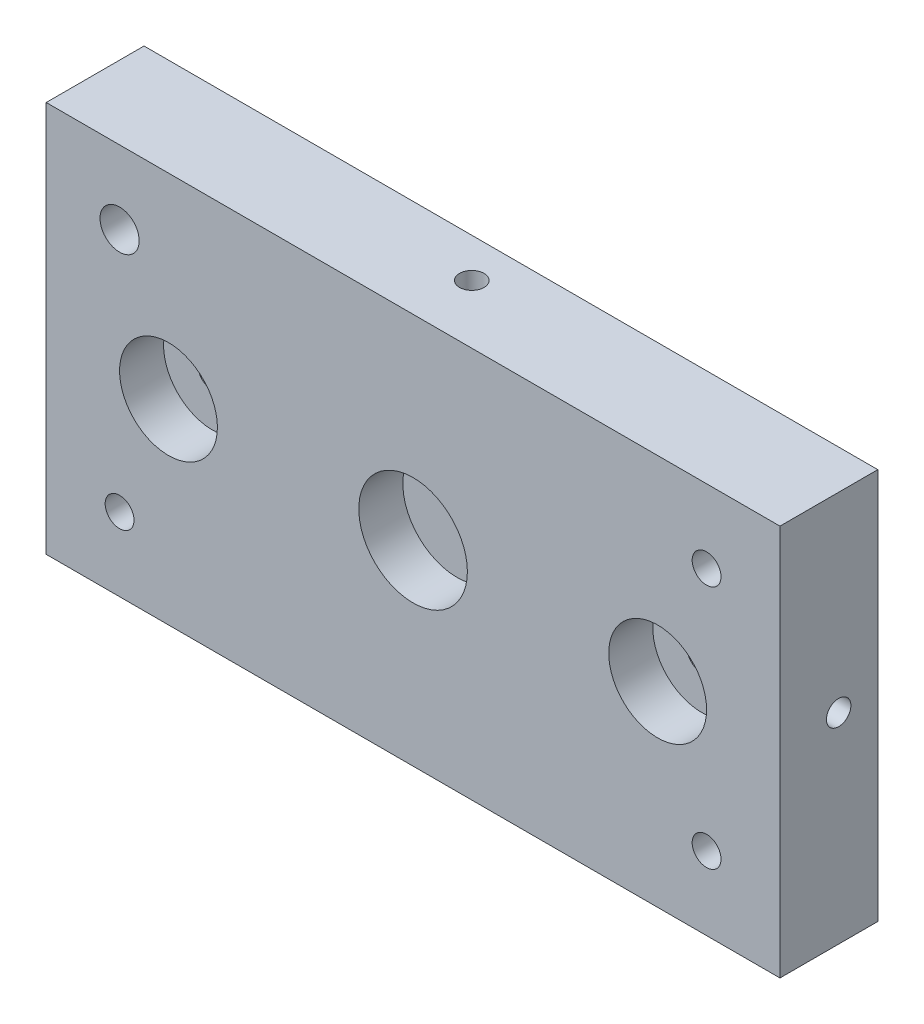
ISO-10303-21;
HEADER;
FILE_DESCRIPTION(('STEP AP214'),'2;1');
FILE_NAME('part.step','',(''),(''),'','','');
FILE_SCHEMA(('AUTOMOTIVE_DESIGN { 1 0 10303 214 1 1 1 1 }'));
ENDSEC;
DATA;
#1=APPLICATION_CONTEXT('core data for automotive mechanical design processes');
#2=APPLICATION_PROTOCOL_DEFINITION('international standard','automotive_design',2000,#1);
#3=PRODUCT_CONTEXT('',#1,'mechanical');
#4=PRODUCT('Part','Part','',(#3));
#5=PRODUCT_RELATED_PRODUCT_CATEGORY('part','',(#4));
#6=PRODUCT_DEFINITION_FORMATION('','',#4);
#7=PRODUCT_DEFINITION_CONTEXT('part definition',#1,'design');
#8=PRODUCT_DEFINITION('design','',#6,#7);
#9=PRODUCT_DEFINITION_SHAPE('','',#8);
#10=(LENGTH_UNIT() NAMED_UNIT(*) SI_UNIT(.MILLI.,.METRE.));
#11=(NAMED_UNIT(*) PLANE_ANGLE_UNIT() SI_UNIT($,.RADIAN.));
#12=(NAMED_UNIT(*) SI_UNIT($,.STERADIAN.) SOLID_ANGLE_UNIT());
#13=UNCERTAINTY_MEASURE_WITH_UNIT(LENGTH_MEASURE(1.E-05),#10,'distance_accuracy_value','');
#14=(GEOMETRIC_REPRESENTATION_CONTEXT(3) GLOBAL_UNCERTAINTY_ASSIGNED_CONTEXT((#13)) GLOBAL_UNIT_ASSIGNED_CONTEXT((#10,
#11,#12)) REPRESENTATION_CONTEXT('',''));
#15=CARTESIAN_POINT('',(0.,0.,0.));
#16=DIRECTION('',(0.,0.,1.));
#17=DIRECTION('',(1.,0.,0.));
#18=AXIS2_PLACEMENT_3D('',#15,#16,#17);
#19=CARTESIAN_POINT('',(50.,0.,-0.001000000000001));
#20=DIRECTION('',(0.,0.,1.));
#21=DIRECTION('',(1.,0.,0.));
#22=AXIS2_PLACEMENT_3D('',#19,#20,#21);
#23=CYLINDRICAL_SURFACE('',#22,3.);
#24=CARTESIAN_POINT('',(50.,0.,11.));
#25=DIRECTION('',(0.,0.,1.));
#26=DIRECTION('',(1.,0.,0.));
#27=AXIS2_PLACEMENT_3D('',#24,#25,#26);
#28=CIRCLE('',#27,3.);
#29=CARTESIAN_POINT('',(53.,0.,11.));
#30=VERTEX_POINT('',#29);
#31=EDGE_CURVE('E106',#30,#30,#28,.F.);
#32=ORIENTED_EDGE('',*,*,#31,.F.);
#33=EDGE_LOOP('',(#32));
#34=FACE_BOUND('',#33,.T.);
#35=CARTESIAN_POINT('',(50.,0.,5.));
#36=DIRECTION('',(0.,0.,-1.));
#37=DIRECTION('',(-1.,0.,0.));
#38=AXIS2_PLACEMENT_3D('',#35,#36,#37);
#39=CIRCLE('',#38,3.);
#40=CARTESIAN_POINT('',(47.,0.,5.));
#41=VERTEX_POINT('',#40);
#42=EDGE_CURVE('E40',#41,#41,#39,.F.);
#43=ORIENTED_EDGE('',*,*,#42,.F.);
#44=EDGE_LOOP('',(#43));
#45=FACE_BOUND('',#44,.T.);
#46=ADVANCED_FACE('F36',(#34,#45),#23,.F.);
#47=CARTESIAN_POINT('',(-50.,0.,-0.001000000000001));
#48=DIRECTION('',(0.,0.,1.));
#49=DIRECTION('',(1.,0.,0.));
#50=AXIS2_PLACEMENT_3D('',#47,#48,#49);
#51=CYLINDRICAL_SURFACE('',#50,3.);
#52=CARTESIAN_POINT('',(-50.,0.,11.));
#53=DIRECTION('',(0.,0.,1.));
#54=DIRECTION('',(1.,0.,0.));
#55=AXIS2_PLACEMENT_3D('',#52,#53,#54);
#56=CIRCLE('',#55,3.);
#57=CARTESIAN_POINT('',(-47.,0.,11.));
#58=VERTEX_POINT('',#57);
#59=EDGE_CURVE('E112',#58,#58,#56,.F.);
#60=ORIENTED_EDGE('',*,*,#59,.F.);
#61=EDGE_LOOP('',(#60));
#62=FACE_BOUND('',#61,.T.);
#63=CARTESIAN_POINT('',(-50.,0.,5.));
#64=DIRECTION('',(0.,0.,-1.));
#65=DIRECTION('',(-1.,0.,0.));
#66=AXIS2_PLACEMENT_3D('',#63,#64,#65);
#67=CIRCLE('',#66,3.);
#68=CARTESIAN_POINT('',(-53.,0.,5.));
#69=VERTEX_POINT('',#68);
#70=EDGE_CURVE('E117',#69,#69,#67,.F.);
#71=ORIENTED_EDGE('',*,*,#70,.F.);
#72=EDGE_LOOP('',(#71));
#73=FACE_BOUND('',#72,.T.);
#74=ADVANCED_FACE('F203',(#62,#73),#51,.F.);
#75=CARTESIAN_POINT('',(-75.0000000000001,-40.,20.));
#76=DIRECTION('',(1.,0.,0.));
#77=DIRECTION('',(0.,0.,-1.));
#78=AXIS2_PLACEMENT_3D('',#75,#76,#77);
#79=PLANE('',#78);
#80=CARTESIAN_POINT('',(-75.0000000000001,0.999999999999999,8.));
#81=DIRECTION('',(-1.,0.,0.));
#82=DIRECTION('',(0.,0.,1.));
#83=AXIS2_PLACEMENT_3D('',#80,#81,#82);
#84=CIRCLE('',#83,2.5);
#85=CARTESIAN_POINT('',(-75.0000000000001,0.999999999999999,10.5));
#86=VERTEX_POINT('',#85);
#87=EDGE_CURVE('E133',#86,#86,#84,.T.);
#88=ORIENTED_EDGE('',*,*,#87,.F.);
#89=EDGE_LOOP('',(#88));
#90=FACE_BOUND('',#89,.T.);
#91=DIRECTION('',(0.,-1.,0.));
#92=VECTOR('',#91,1.);
#93=CARTESIAN_POINT('',(-75.0000000000001,-40.,0.));
#94=LINE('',#93,#92);
#95=CARTESIAN_POINT('',(-75.0000000000001,40.,0.));
#96=VERTEX_POINT('',#95);
#97=CARTESIAN_POINT('',(-75.0000000000001,-40.,0.));
#98=VERTEX_POINT('',#97);
#99=EDGE_CURVE('E103',#96,#98,#94,.T.);
#100=ORIENTED_EDGE('',*,*,#99,.T.);
#101=DIRECTION('',(0.,0.,-1.));
#102=VECTOR('',#101,1.);
#103=CARTESIAN_POINT('',(-75.0000000000001,-40.,20.));
#104=LINE('',#103,#102);
#105=CARTESIAN_POINT('',(-75.0000000000001,-40.,20.));
#106=VERTEX_POINT('',#105);
#107=EDGE_CURVE('E11',#106,#98,#104,.T.);
#108=ORIENTED_EDGE('',*,*,#107,.F.);
#109=DIRECTION('',(0.,-1.,0.));
#110=VECTOR('',#109,1.);
#111=CARTESIAN_POINT('',(-75.0000000000001,-40.,20.));
#112=LINE('',#111,#110);
#113=CARTESIAN_POINT('',(-75.0000000000001,40.,20.));
#114=VERTEX_POINT('',#113);
#115=EDGE_CURVE('E90',#114,#106,#112,.T.);
#116=ORIENTED_EDGE('',*,*,#115,.F.);
#117=DIRECTION('',(0.,0.,-1.));
#118=VECTOR('',#117,1.);
#119=CARTESIAN_POINT('',(-75.0000000000001,40.,20.));
#120=LINE('',#119,#118);
#121=EDGE_CURVE('E99',#114,#96,#120,.T.);
#122=ORIENTED_EDGE('',*,*,#121,.T.);
#123=EDGE_LOOP('',(#100,#108,#116,#122));
#124=FACE_BOUND('',#123,.T.);
#125=ADVANCED_FACE('F38',(#90,#124),#79,.F.);
#126=CARTESIAN_POINT('',(74.9999999999999,-40.,20.));
#127=DIRECTION('',(0.,1.,0.));
#128=DIRECTION('',(-1.,0.,0.));
#129=AXIS2_PLACEMENT_3D('',#126,#127,#128);
#130=PLANE('',#129);
#131=CARTESIAN_POINT('',(-62.0000000000001,-40.,8.));
#132=DIRECTION('',(0.,-1.,0.));
#133=DIRECTION('',(1.,0.,0.));
#134=AXIS2_PLACEMENT_3D('',#131,#132,#133);
#135=CIRCLE('',#134,2.5);
#136=CARTESIAN_POINT('',(-59.5000000000001,-40.,8.));
#137=VERTEX_POINT('',#136);
#138=EDGE_CURVE('E323',#137,#137,#135,.T.);
#139=ORIENTED_EDGE('',*,*,#138,.F.);
#140=EDGE_LOOP('',(#139));
#141=FACE_BOUND('',#140,.T.);
#142=CARTESIAN_POINT('',(62.0000000000001,-40.,8.00000000000002));
#143=DIRECTION('',(0.,-1.,0.));
#144=DIRECTION('',(-1.,0.,0.));
#145=AXIS2_PLACEMENT_3D('',#142,#143,#144);
#146=CIRCLE('',#145,2.50000000000002);
#147=CARTESIAN_POINT('',(59.5000000000001,-40.,8.00000000000002));
#148=VERTEX_POINT('',#147);
#149=EDGE_CURVE('E310',#148,#148,#146,.T.);
#150=ORIENTED_EDGE('',*,*,#149,.F.);
#151=EDGE_LOOP('',(#150));
#152=FACE_BOUND('',#151,.T.);
#153=DIRECTION('',(1.,0.,0.));
#154=VECTOR('',#153,1.);
#155=CARTESIAN_POINT('',(74.9999999999999,-40.,0.));
#156=LINE('',#155,#154);
#157=CARTESIAN_POINT('',(74.9999999999999,-40.,0.));
#158=VERTEX_POINT('',#157);
#159=EDGE_CURVE('E94',#98,#158,#156,.T.);
#160=ORIENTED_EDGE('',*,*,#159,.T.);
#161=DIRECTION('',(0.,0.,-1.));
#162=VECTOR('',#161,1.);
#163=CARTESIAN_POINT('',(74.9999999999999,-40.,20.));
#164=LINE('',#163,#162);
#165=CARTESIAN_POINT('',(74.9999999999999,-40.,20.));
#166=VERTEX_POINT('',#165);
#167=EDGE_CURVE('E46',#166,#158,#164,.T.);
#168=ORIENTED_EDGE('',*,*,#167,.F.);
#169=DIRECTION('',(1.,0.,0.));
#170=VECTOR('',#169,1.);
#171=CARTESIAN_POINT('',(74.9999999999999,-40.,20.));
#172=LINE('',#171,#170);
#173=EDGE_CURVE('E85',#106,#166,#172,.T.);
#174=ORIENTED_EDGE('',*,*,#173,.F.);
#175=ORIENTED_EDGE('',*,*,#107,.T.);
#176=EDGE_LOOP('',(#160,#168,#174,#175));
#177=FACE_BOUND('',#176,.T.);
#178=ADVANCED_FACE('F93',(#141,#152,#177),#130,.F.);
#179=CARTESIAN_POINT('',(74.9999999999999,-40.,20.));
#180=DIRECTION('',(-1.,0.,0.));
#181=DIRECTION('',(0.,0.,1.));
#182=AXIS2_PLACEMENT_3D('',#179,#180,#181);
#183=PLANE('',#182);
#184=CARTESIAN_POINT('',(75.0000000000001,0.999999999999999,8.));
#185=DIRECTION('',(-1.,0.,0.));
#186=DIRECTION('',(0.,0.,1.));
#187=AXIS2_PLACEMENT_3D('',#184,#185,#186);
#188=CIRCLE('',#187,2.5);
#189=CARTESIAN_POINT('',(75.0000000000001,0.999999999999999,10.5));
#190=VERTEX_POINT('',#189);
#191=EDGE_CURVE('E322',#190,#190,#188,.T.);
#192=ORIENTED_EDGE('',*,*,#191,.T.);
#193=EDGE_LOOP('',(#192));
#194=FACE_BOUND('',#193,.T.);
#195=DIRECTION('',(0.,1.,0.));
#196=VECTOR('',#195,1.);
#197=CARTESIAN_POINT('',(74.9999999999999,-40.,0.));
#198=LINE('',#197,#196);
#199=CARTESIAN_POINT('',(74.9999999999999,40.,0.));
#200=VERTEX_POINT('',#199);
#201=EDGE_CURVE('E72',#158,#200,#198,.T.);
#202=ORIENTED_EDGE('',*,*,#201,.T.);
#203=DIRECTION('',(0.,0.,-1.));
#204=VECTOR('',#203,1.);
#205=CARTESIAN_POINT('',(74.9999999999999,40.,20.));
#206=LINE('',#205,#204);
#207=CARTESIAN_POINT('',(74.9999999999999,40.,20.));
#208=VERTEX_POINT('',#207);
#209=EDGE_CURVE('E95',#208,#200,#206,.T.);
#210=ORIENTED_EDGE('',*,*,#209,.F.);
#211=DIRECTION('',(0.,1.,0.));
#212=VECTOR('',#211,1.);
#213=CARTESIAN_POINT('',(74.9999999999999,-40.,20.));
#214=LINE('',#213,#212);
#215=EDGE_CURVE('E88',#166,#208,#214,.T.);
#216=ORIENTED_EDGE('',*,*,#215,.F.);
#217=ORIENTED_EDGE('',*,*,#167,.T.);
#218=EDGE_LOOP('',(#202,#210,#216,#217));
#219=FACE_BOUND('',#218,.T.);
#220=ADVANCED_FACE('F97',(#194,#219),#183,.F.);
#221=CARTESIAN_POINT('',(74.9999999999999,40.,20.));
#222=DIRECTION('',(0.,-1.,0.));
#223=DIRECTION('',(1.,0.,0.));
#224=AXIS2_PLACEMENT_3D('',#221,#222,#223);
#225=PLANE('',#224);
#226=CARTESIAN_POINT('',(0.,40.,8.));
#227=DIRECTION('',(0.,1.,0.));
#228=DIRECTION('',(-1.,0.,0.));
#229=AXIS2_PLACEMENT_3D('',#226,#227,#228);
#230=CIRCLE('',#229,2.5);
#231=CARTESIAN_POINT('',(-2.49999999999999,40.,8.));
#232=VERTEX_POINT('',#231);
#233=EDGE_CURVE('E311',#232,#232,#230,.T.);
#234=ORIENTED_EDGE('',*,*,#233,.F.);
#235=EDGE_LOOP('',(#234));
#236=FACE_BOUND('',#235,.T.);
#237=DIRECTION('',(-1.,0.,0.));
#238=VECTOR('',#237,1.);
#239=CARTESIAN_POINT('',(74.9999999999999,40.,0.));
#240=LINE('',#239,#238);
#241=EDGE_CURVE('E78',#200,#96,#240,.T.);
#242=ORIENTED_EDGE('',*,*,#241,.T.);
#243=ORIENTED_EDGE('',*,*,#121,.F.);
#244=DIRECTION('',(-1.,0.,0.));
#245=VECTOR('',#244,1.);
#246=CARTESIAN_POINT('',(74.9999999999999,40.,20.));
#247=LINE('',#246,#245);
#248=EDGE_CURVE('E55',#208,#114,#247,.T.);
#249=ORIENTED_EDGE('',*,*,#248,.F.);
#250=ORIENTED_EDGE('',*,*,#209,.T.);
#251=EDGE_LOOP('',(#242,#243,#249,#250));
#252=FACE_BOUND('',#251,.T.);
#253=ADVANCED_FACE('F187',(#236,#252),#225,.F.);
#254=CARTESIAN_POINT('',(0.,0.,20.));
#255=DIRECTION('',(0.,0.,1.));
#256=DIRECTION('',(1.,0.,0.));
#257=AXIS2_PLACEMENT_3D('',#254,#255,#256);
#258=PLANE('',#257);
#259=CARTESIAN_POINT('',(-60.,-25.,20.));
#260=DIRECTION('',(0.,0.,1.));
#261=DIRECTION('',(-1.,0.,0.));
#262=AXIS2_PLACEMENT_3D('',#259,#260,#261);
#263=CIRCLE('',#262,2.94960503457451);
#264=CARTESIAN_POINT('',(-62.9496050345745,-25.,20.));
#265=VERTEX_POINT('',#264);
#266=EDGE_CURVE('E123',#265,#265,#263,.T.);
#267=ORIENTED_EDGE('',*,*,#266,.F.);
#268=EDGE_LOOP('',(#267));
#269=FACE_BOUND('',#268,.T.);
#270=CARTESIAN_POINT('',(60.,-25.,20.));
#271=DIRECTION('',(0.,0.,1.));
#272=DIRECTION('',(1.,0.,0.));
#273=AXIS2_PLACEMENT_3D('',#270,#271,#272);
#274=CIRCLE('',#273,2.94960503457452);
#275=CARTESIAN_POINT('',(62.9496050345745,-25.,20.));
#276=VERTEX_POINT('',#275);
#277=EDGE_CURVE('E150',#276,#276,#274,.T.);
#278=ORIENTED_EDGE('',*,*,#277,.F.);
#279=EDGE_LOOP('',(#278));
#280=FACE_BOUND('',#279,.T.);
#281=CARTESIAN_POINT('',(60.,25.,20.));
#282=DIRECTION('',(0.,0.,1.));
#283=DIRECTION('',(-1.,0.,0.));
#284=AXIS2_PLACEMENT_3D('',#281,#282,#283);
#285=CIRCLE('',#284,2.94960503457452);
#286=CARTESIAN_POINT('',(57.0503949654255,25.,20.));
#287=VERTEX_POINT('',#286);
#288=EDGE_CURVE('E142',#287,#287,#285,.T.);
#289=ORIENTED_EDGE('',*,*,#288,.F.);
#290=EDGE_LOOP('',(#289));
#291=FACE_BOUND('',#290,.T.);
#292=CARTESIAN_POINT('',(-60.,25.,20.));
#293=DIRECTION('',(0.,0.,1.));
#294=DIRECTION('',(1.,0.,0.));
#295=AXIS2_PLACEMENT_3D('',#292,#293,#294);
#296=CIRCLE('',#295,4.00000000000001);
#297=CARTESIAN_POINT('',(-56.,25.,20.));
#298=VERTEX_POINT('',#297);
#299=EDGE_CURVE('E149',#298,#298,#296,.T.);
#300=ORIENTED_EDGE('',*,*,#299,.F.);
#301=EDGE_LOOP('',(#300));
#302=FACE_BOUND('',#301,.T.);
#303=CARTESIAN_POINT('',(50.,0.,20.));
#304=DIRECTION('',(0.,0.,1.));
#305=DIRECTION('',(1.,0.,0.));
#306=AXIS2_PLACEMENT_3D('',#303,#304,#305);
#307=CIRCLE('',#306,10.);
#308=CARTESIAN_POINT('',(60.,0.,20.));
#309=VERTEX_POINT('',#308);
#310=EDGE_CURVE('E165',#309,#309,#307,.T.);
#311=ORIENTED_EDGE('',*,*,#310,.F.);
#312=EDGE_LOOP('',(#311));
#313=FACE_BOUND('',#312,.T.);
#314=CARTESIAN_POINT('',(-50.,0.,20.));
#315=DIRECTION('',(0.,0.,1.));
#316=DIRECTION('',(1.,0.,0.));
#317=AXIS2_PLACEMENT_3D('',#314,#315,#316);
#318=CIRCLE('',#317,10.);
#319=CARTESIAN_POINT('',(-40.,0.,20.));
#320=VERTEX_POINT('',#319);
#321=EDGE_CURVE('E170',#320,#320,#318,.T.);
#322=ORIENTED_EDGE('',*,*,#321,.F.);
#323=EDGE_LOOP('',(#322));
#324=FACE_BOUND('',#323,.T.);
#325=CARTESIAN_POINT('',(0.,0.,20.));
#326=DIRECTION('',(0.,0.,1.));
#327=DIRECTION('',(1.,0.,0.));
#328=AXIS2_PLACEMENT_3D('',#325,#326,#327);
#329=CIRCLE('',#328,11.1);
#330=CARTESIAN_POINT('',(11.1,0.,20.));
#331=VERTEX_POINT('',#330);
#332=EDGE_CURVE('E169',#331,#331,#329,.T.);
#333=ORIENTED_EDGE('',*,*,#332,.F.);
#334=EDGE_LOOP('',(#333));
#335=FACE_BOUND('',#334,.T.);
#336=ORIENTED_EDGE('',*,*,#115,.T.);
#337=ORIENTED_EDGE('',*,*,#173,.T.);
#338=ORIENTED_EDGE('',*,*,#215,.T.);
#339=ORIENTED_EDGE('',*,*,#248,.T.);
#340=EDGE_LOOP('',(#336,#337,#338,#339));
#341=FACE_BOUND('',#340,.T.);
#342=ADVANCED_FACE('F86',(#269,#280,#291,#302,#313,#324,#335,#341),#258,.T.);
#343=CARTESIAN_POINT('',(0.,0.,0.));
#344=DIRECTION('',(0.,0.,1.));
#345=DIRECTION('',(1.,0.,0.));
#346=AXIS2_PLACEMENT_3D('',#343,#344,#345);
#347=PLANE('',#346);
#348=CARTESIAN_POINT('',(50.,0.,0.));
#349=DIRECTION('',(0.,0.,-1.));
#350=DIRECTION('',(-1.,0.,0.));
#351=AXIS2_PLACEMENT_3D('',#348,#349,#350);
#352=CIRCLE('',#351,5.);
#353=CARTESIAN_POINT('',(45.,0.,0.));
#354=VERTEX_POINT('',#353);
#355=EDGE_CURVE('E125',#354,#354,#352,.T.);
#356=ORIENTED_EDGE('',*,*,#355,.F.);
#357=EDGE_LOOP('',(#356));
#358=FACE_BOUND('',#357,.T.);
#359=CARTESIAN_POINT('',(-50.,0.,0.));
#360=DIRECTION('',(0.,0.,-1.));
#361=DIRECTION('',(-1.,0.,0.));
#362=AXIS2_PLACEMENT_3D('',#359,#360,#361);
#363=CIRCLE('',#362,5.);
#364=CARTESIAN_POINT('',(-55.,0.,0.));
#365=VERTEX_POINT('',#364);
#366=EDGE_CURVE('E138',#365,#365,#363,.T.);
#367=ORIENTED_EDGE('',*,*,#366,.F.);
#368=EDGE_LOOP('',(#367));
#369=FACE_BOUND('',#368,.T.);
#370=CARTESIAN_POINT('',(-60.,-25.,0.));
#371=DIRECTION('',(0.,0.,1.));
#372=DIRECTION('',(1.,0.,0.));
#373=AXIS2_PLACEMENT_3D('',#370,#371,#372);
#374=CIRCLE('',#373,2.94960503457451);
#375=CARTESIAN_POINT('',(-57.0503949654255,-25.,0.));
#376=VERTEX_POINT('',#375);
#377=EDGE_CURVE('E153',#376,#376,#374,.F.);
#378=ORIENTED_EDGE('',*,*,#377,.F.);
#379=EDGE_LOOP('',(#378));
#380=FACE_BOUND('',#379,.T.);
#381=CARTESIAN_POINT('',(60.,-25.,0.));
#382=DIRECTION('',(0.,0.,1.));
#383=DIRECTION('',(1.,0.,0.));
#384=AXIS2_PLACEMENT_3D('',#381,#382,#383);
#385=CIRCLE('',#384,2.94960503457452);
#386=CARTESIAN_POINT('',(62.9496050345745,-25.,0.));
#387=VERTEX_POINT('',#386);
#388=EDGE_CURVE('E146',#387,#387,#385,.F.);
#389=ORIENTED_EDGE('',*,*,#388,.F.);
#390=EDGE_LOOP('',(#389));
#391=FACE_BOUND('',#390,.T.);
#392=CARTESIAN_POINT('',(60.,25.,0.));
#393=DIRECTION('',(0.,0.,1.));
#394=DIRECTION('',(1.,0.,0.));
#395=AXIS2_PLACEMENT_3D('',#392,#393,#394);
#396=CIRCLE('',#395,2.94960503457452);
#397=CARTESIAN_POINT('',(62.9496050345745,25.,0.));
#398=VERTEX_POINT('',#397);
#399=EDGE_CURVE('E145',#398,#398,#396,.F.);
#400=ORIENTED_EDGE('',*,*,#399,.F.);
#401=EDGE_LOOP('',(#400));
#402=FACE_BOUND('',#401,.T.);
#403=CARTESIAN_POINT('',(-60.,25.,0.));
#404=DIRECTION('',(0.,0.,1.));
#405=DIRECTION('',(1.,0.,0.));
#406=AXIS2_PLACEMENT_3D('',#403,#404,#405);
#407=CIRCLE('',#406,4.00000000000001);
#408=CARTESIAN_POINT('',(-56.,25.,0.));
#409=VERTEX_POINT('',#408);
#410=EDGE_CURVE('E162',#409,#409,#407,.F.);
#411=ORIENTED_EDGE('',*,*,#410,.F.);
#412=EDGE_LOOP('',(#411));
#413=FACE_BOUND('',#412,.T.);
#414=ORIENTED_EDGE('',*,*,#99,.F.);
#415=ORIENTED_EDGE('',*,*,#241,.F.);
#416=ORIENTED_EDGE('',*,*,#201,.F.);
#417=ORIENTED_EDGE('',*,*,#159,.F.);
#418=EDGE_LOOP('',(#414,#415,#416,#417));
#419=FACE_BOUND('',#418,.T.);
#420=ADVANCED_FACE('F186',(#358,#369,#380,#391,#402,#413,#419),#347,.F.);
#421=CARTESIAN_POINT('',(-50.,0.,11.));
#422=DIRECTION('',(0.,0.,1.));
#423=DIRECTION('',(1.,0.,0.));
#424=AXIS2_PLACEMENT_3D('',#421,#422,#423);
#425=PLANE('',#424);
#426=CARTESIAN_POINT('',(-50.,0.,11.));
#427=DIRECTION('',(0.,0.,1.));
#428=DIRECTION('',(1.,0.,0.));
#429=AXIS2_PLACEMENT_3D('',#426,#427,#428);
#430=CIRCLE('',#429,10.);
#431=CARTESIAN_POINT('',(-40.,0.,11.));
#432=VERTEX_POINT('',#431);
#433=EDGE_CURVE('E166',#432,#432,#430,.T.);
#434=ORIENTED_EDGE('',*,*,#433,.T.);
#435=EDGE_LOOP('',(#434));
#436=FACE_BOUND('',#435,.T.);
#437=ORIENTED_EDGE('',*,*,#59,.T.);
#438=EDGE_LOOP('',(#437));
#439=FACE_BOUND('',#438,.T.);
#440=ADVANCED_FACE('F194',(#436,#439),#425,.T.);
#441=CARTESIAN_POINT('',(-50.,0.,11.));
#442=DIRECTION('',(0.,0.,1.));
#443=DIRECTION('',(1.,0.,0.));
#444=AXIS2_PLACEMENT_3D('',#441,#442,#443);
#445=CYLINDRICAL_SURFACE('',#444,10.);
#446=ORIENTED_EDGE('',*,*,#433,.F.);
#447=EDGE_LOOP('',(#446));
#448=FACE_BOUND('',#447,.T.);
#449=ORIENTED_EDGE('',*,*,#321,.T.);
#450=EDGE_LOOP('',(#449));
#451=FACE_BOUND('',#450,.T.);
#452=ADVANCED_FACE('F228',(#448,#451),#445,.F.);
#453=CARTESIAN_POINT('',(50.,0.,11.));
#454=DIRECTION('',(0.,0.,1.));
#455=DIRECTION('',(1.,0.,0.));
#456=AXIS2_PLACEMENT_3D('',#453,#454,#455);
#457=PLANE('',#456);
#458=CARTESIAN_POINT('',(50.,0.,11.));
#459=DIRECTION('',(0.,0.,1.));
#460=DIRECTION('',(1.,0.,0.));
#461=AXIS2_PLACEMENT_3D('',#458,#459,#460);
#462=CIRCLE('',#461,10.);
#463=CARTESIAN_POINT('',(60.,0.,11.));
#464=VERTEX_POINT('',#463);
#465=EDGE_CURVE('E173',#464,#464,#462,.T.);
#466=ORIENTED_EDGE('',*,*,#465,.T.);
#467=EDGE_LOOP('',(#466));
#468=FACE_BOUND('',#467,.T.);
#469=ORIENTED_EDGE('',*,*,#31,.T.);
#470=EDGE_LOOP('',(#469));
#471=FACE_BOUND('',#470,.T.);
#472=ADVANCED_FACE('F224',(#468,#471),#457,.T.);
#473=CARTESIAN_POINT('',(50.,0.,11.));
#474=DIRECTION('',(0.,0.,1.));
#475=DIRECTION('',(1.,0.,0.));
#476=AXIS2_PLACEMENT_3D('',#473,#474,#475);
#477=CYLINDRICAL_SURFACE('',#476,10.);
#478=ORIENTED_EDGE('',*,*,#465,.F.);
#479=EDGE_LOOP('',(#478));
#480=FACE_BOUND('',#479,.T.);
#481=ORIENTED_EDGE('',*,*,#310,.T.);
#482=EDGE_LOOP('',(#481));
#483=FACE_BOUND('',#482,.T.);
#484=ADVANCED_FACE('F216',(#480,#483),#477,.F.);
#485=CARTESIAN_POINT('',(0.,0.,11.));
#486=DIRECTION('',(0.,0.,1.));
#487=DIRECTION('',(1.,0.,0.));
#488=AXIS2_PLACEMENT_3D('',#485,#486,#487);
#489=CYLINDRICAL_SURFACE('',#488,11.1);
#490=CARTESIAN_POINT('',(0.,0.,11.));
#491=DIRECTION('',(0.,0.,1.));
#492=DIRECTION('',(1.,0.,0.));
#493=AXIS2_PLACEMENT_3D('',#490,#491,#492);
#494=CIRCLE('',#493,11.1);
#495=CARTESIAN_POINT('',(11.1,0.,11.));
#496=VERTEX_POINT('',#495);
#497=EDGE_CURVE('E115',#496,#496,#494,.T.);
#498=ORIENTED_EDGE('',*,*,#497,.F.);
#499=EDGE_LOOP('',(#498));
#500=FACE_BOUND('',#499,.T.);
#501=ORIENTED_EDGE('',*,*,#332,.T.);
#502=EDGE_LOOP('',(#501));
#503=FACE_BOUND('',#502,.T.);
#504=ADVANCED_FACE('F183',(#500,#503),#489,.F.);
#505=CARTESIAN_POINT('',(0.,0.,11.));
#506=DIRECTION('',(0.,0.,1.));
#507=DIRECTION('',(1.,0.,0.));
#508=AXIS2_PLACEMENT_3D('',#505,#506,#507);
#509=PLANE('',#508);
#510=ORIENTED_EDGE('',*,*,#497,.T.);
#511=EDGE_LOOP('',(#510));
#512=FACE_BOUND('',#511,.T.);
#513=ADVANCED_FACE('F215',(#512),#509,.T.);
#514=CARTESIAN_POINT('',(-60.,25.,-0.001000000000001));
#515=DIRECTION('',(0.,0.,1.));
#516=DIRECTION('',(1.,0.,0.));
#517=AXIS2_PLACEMENT_3D('',#514,#515,#516);
#518=CYLINDRICAL_SURFACE('',#517,4.00000000000001);
#519=ORIENTED_EDGE('',*,*,#299,.T.);
#520=EDGE_LOOP('',(#519));
#521=FACE_BOUND('',#520,.T.);
#522=ORIENTED_EDGE('',*,*,#410,.T.);
#523=EDGE_LOOP('',(#522));
#524=FACE_BOUND('',#523,.T.);
#525=ADVANCED_FACE('F220',(#521,#524),#518,.F.);
#526=CARTESIAN_POINT('',(60.,25.,-0.001000000000001));
#527=DIRECTION('',(0.,0.,1.));
#528=DIRECTION('',(1.,0.,0.));
#529=AXIS2_PLACEMENT_3D('',#526,#527,#528);
#530=CYLINDRICAL_SURFACE('',#529,2.94960503457452);
#531=ORIENTED_EDGE('',*,*,#288,.T.);
#532=EDGE_LOOP('',(#531));
#533=FACE_BOUND('',#532,.T.);
#534=ORIENTED_EDGE('',*,*,#399,.T.);
#535=EDGE_LOOP('',(#534));
#536=FACE_BOUND('',#535,.T.);
#537=ADVANCED_FACE('F238',(#533,#536),#530,.F.);
#538=CARTESIAN_POINT('',(60.,-25.,-0.001000000000001));
#539=DIRECTION('',(0.,0.,1.));
#540=DIRECTION('',(1.,0.,0.));
#541=AXIS2_PLACEMENT_3D('',#538,#539,#540);
#542=CYLINDRICAL_SURFACE('',#541,2.94960503457452);
#543=ORIENTED_EDGE('',*,*,#277,.T.);
#544=EDGE_LOOP('',(#543));
#545=FACE_BOUND('',#544,.T.);
#546=ORIENTED_EDGE('',*,*,#388,.T.);
#547=EDGE_LOOP('',(#546));
#548=FACE_BOUND('',#547,.T.);
#549=ADVANCED_FACE('F244',(#545,#548),#542,.F.);
#550=CARTESIAN_POINT('',(-60.,-25.,-0.001000000000001));
#551=DIRECTION('',(0.,0.,1.));
#552=DIRECTION('',(1.,0.,0.));
#553=AXIS2_PLACEMENT_3D('',#550,#551,#552);
#554=CYLINDRICAL_SURFACE('',#553,2.94960503457451);
#555=ORIENTED_EDGE('',*,*,#266,.T.);
#556=EDGE_LOOP('',(#555));
#557=FACE_BOUND('',#556,.T.);
#558=ORIENTED_EDGE('',*,*,#377,.T.);
#559=EDGE_LOOP('',(#558));
#560=FACE_BOUND('',#559,.T.);
#561=ADVANCED_FACE('F240',(#557,#560),#554,.F.);
#562=CARTESIAN_POINT('',(-50.,0.,5.));
#563=DIRECTION('',(0.,0.,-1.));
#564=DIRECTION('',(-1.,0.,0.));
#565=AXIS2_PLACEMENT_3D('',#562,#563,#564);
#566=PLANE('',#565);
#567=CARTESIAN_POINT('',(-50.,0.,5.));
#568=DIRECTION('',(0.,0.,-1.));
#569=DIRECTION('',(-1.,0.,0.));
#570=AXIS2_PLACEMENT_3D('',#567,#568,#569);
#571=CIRCLE('',#570,5.);
#572=CARTESIAN_POINT('',(-55.,0.,5.));
#573=VERTEX_POINT('',#572);
#574=EDGE_CURVE('E130',#573,#573,#571,.T.);
#575=ORIENTED_EDGE('',*,*,#574,.T.);
#576=EDGE_LOOP('',(#575));
#577=FACE_BOUND('',#576,.T.);
#578=ORIENTED_EDGE('',*,*,#70,.T.);
#579=EDGE_LOOP('',(#578));
#580=FACE_BOUND('',#579,.T.);
#581=ADVANCED_FACE('F243',(#577,#580),#566,.T.);
#582=CARTESIAN_POINT('',(-50.,0.,5.));
#583=DIRECTION('',(0.,0.,-1.));
#584=DIRECTION('',(-1.,0.,0.));
#585=AXIS2_PLACEMENT_3D('',#582,#583,#584);
#586=CYLINDRICAL_SURFACE('',#585,5.);
#587=ORIENTED_EDGE('',*,*,#574,.F.);
#588=EDGE_LOOP('',(#587));
#589=FACE_BOUND('',#588,.T.);
#590=ORIENTED_EDGE('',*,*,#366,.T.);
#591=EDGE_LOOP('',(#590));
#592=FACE_BOUND('',#591,.T.);
#593=ADVANCED_FACE('F252',(#589,#592),#586,.F.);
#594=CARTESIAN_POINT('',(50.,0.,5.));
#595=DIRECTION('',(0.,0.,-1.));
#596=DIRECTION('',(-1.,0.,0.));
#597=AXIS2_PLACEMENT_3D('',#594,#595,#596);
#598=PLANE('',#597);
#599=CARTESIAN_POINT('',(50.,0.,5.));
#600=DIRECTION('',(0.,0.,-1.));
#601=DIRECTION('',(-1.,0.,0.));
#602=AXIS2_PLACEMENT_3D('',#599,#600,#601);
#603=CIRCLE('',#602,5.);
#604=CARTESIAN_POINT('',(45.,0.,5.));
#605=VERTEX_POINT('',#604);
#606=EDGE_CURVE('E119',#605,#605,#603,.T.);
#607=ORIENTED_EDGE('',*,*,#606,.T.);
#608=EDGE_LOOP('',(#607));
#609=FACE_BOUND('',#608,.T.);
#610=ORIENTED_EDGE('',*,*,#42,.T.);
#611=EDGE_LOOP('',(#610));
#612=FACE_BOUND('',#611,.T.);
#613=ADVANCED_FACE('F255',(#609,#612),#598,.T.);
#614=CARTESIAN_POINT('',(50.,0.,5.));
#615=DIRECTION('',(0.,0.,-1.));
#616=DIRECTION('',(-1.,0.,0.));
#617=AXIS2_PLACEMENT_3D('',#614,#615,#616);
#618=CYLINDRICAL_SURFACE('',#617,5.);
#619=ORIENTED_EDGE('',*,*,#606,.F.);
#620=EDGE_LOOP('',(#619));
#621=FACE_BOUND('',#620,.T.);
#622=ORIENTED_EDGE('',*,*,#355,.T.);
#623=EDGE_LOOP('',(#622));
#624=FACE_BOUND('',#623,.T.);
#625=ADVANCED_FACE('F260',(#621,#624),#618,.F.);
#626=CARTESIAN_POINT('',(-65.0000000000001,0.999999999999999,8.));
#627=DIRECTION('',(-1.,0.,0.));
#628=DIRECTION('',(0.,0.,1.));
#629=AXIS2_PLACEMENT_3D('',#626,#627,#628);
#630=CYLINDRICAL_SURFACE('',#629,2.5);
#631=CARTESIAN_POINT('',(-65.0000000000001,0.999999999999999,8.));
#632=DIRECTION('',(-1.,0.,0.));
#633=DIRECTION('',(0.,0.,1.));
#634=AXIS2_PLACEMENT_3D('',#631,#632,#633);
#635=CIRCLE('',#634,2.5);
#636=CARTESIAN_POINT('',(-65.0000000000001,0.999999999999999,10.5));
#637=VERTEX_POINT('',#636);
#638=EDGE_CURVE('E141',#637,#637,#635,.T.);
#639=ORIENTED_EDGE('',*,*,#638,.F.);
#640=EDGE_LOOP('',(#639));
#641=FACE_BOUND('',#640,.T.);
#642=ORIENTED_EDGE('',*,*,#87,.T.);
#643=EDGE_LOOP('',(#642));
#644=FACE_BOUND('',#643,.T.);
#645=ADVANCED_FACE('F263',(#641,#644),#630,.F.);
#646=CARTESIAN_POINT('',(-65.0000000000001,0.999999999999999,8.));
#647=DIRECTION('',(-1.,0.,0.));
#648=DIRECTION('',(0.,0.,1.));
#649=AXIS2_PLACEMENT_3D('',#646,#647,#648);
#650=PLANE('',#649);
#651=ORIENTED_EDGE('',*,*,#638,.T.);
#652=EDGE_LOOP('',(#651));
#653=FACE_BOUND('',#652,.T.);
#654=ADVANCED_FACE('F269',(#653),#650,.T.);
#655=CARTESIAN_POINT('',(65.0000000000001,0.999999999999999,8.));
#656=DIRECTION('',(1.,0.,0.));
#657=DIRECTION('',(0.,0.,-1.));
#658=AXIS2_PLACEMENT_3D('',#655,#656,#657);
#659=CYLINDRICAL_SURFACE('',#658,2.5);
#660=CARTESIAN_POINT('',(65.0000000000001,0.999999999999999,8.));
#661=DIRECTION('',(-1.,0.,0.));
#662=DIRECTION('',(0.,0.,1.));
#663=AXIS2_PLACEMENT_3D('',#660,#661,#662);
#664=CIRCLE('',#663,2.5);
#665=CARTESIAN_POINT('',(65.0000000000001,0.999999999999999,10.5));
#666=VERTEX_POINT('',#665);
#667=EDGE_CURVE('E328',#666,#666,#664,.T.);
#668=ORIENTED_EDGE('',*,*,#667,.T.);
#669=EDGE_LOOP('',(#668));
#670=FACE_BOUND('',#669,.T.);
#671=ORIENTED_EDGE('',*,*,#191,.F.);
#672=EDGE_LOOP('',(#671));
#673=FACE_BOUND('',#672,.T.);
#674=ADVANCED_FACE('F273',(#670,#673),#659,.F.);
#675=CARTESIAN_POINT('',(65.0000000000001,0.999999999999999,8.));
#676=DIRECTION('',(1.,0.,0.));
#677=DIRECTION('',(0.,0.,1.));
#678=AXIS2_PLACEMENT_3D('',#675,#676,#677);
#679=PLANE('',#678);
#680=ORIENTED_EDGE('',*,*,#667,.F.);
#681=EDGE_LOOP('',(#680));
#682=FACE_BOUND('',#681,.T.);
#683=ADVANCED_FACE('F277',(#682),#679,.T.);
#684=CARTESIAN_POINT('',(62.0000000000001,-30.,8.00000000000002));
#685=DIRECTION('',(0.,-1.,0.));
#686=DIRECTION('',(1.,0.,0.));
#687=AXIS2_PLACEMENT_3D('',#684,#685,#686);
#688=CYLINDRICAL_SURFACE('',#687,2.50000000000002);
#689=CARTESIAN_POINT('',(62.0000000000001,-30.,8.00000000000002));
#690=DIRECTION('',(0.,-1.,0.));
#691=DIRECTION('',(-1.,0.,0.));
#692=AXIS2_PLACEMENT_3D('',#689,#690,#691);
#693=CIRCLE('',#692,2.50000000000002);
#694=CARTESIAN_POINT('',(59.5000000000001,-30.,8.00000000000002));
#695=VERTEX_POINT('',#694);
#696=EDGE_CURVE('E314',#695,#695,#693,.T.);
#697=ORIENTED_EDGE('',*,*,#696,.F.);
#698=EDGE_LOOP('',(#697));
#699=FACE_BOUND('',#698,.T.);
#700=ORIENTED_EDGE('',*,*,#149,.T.);
#701=EDGE_LOOP('',(#700));
#702=FACE_BOUND('',#701,.T.);
#703=ADVANCED_FACE('F281',(#699,#702),#688,.F.);
#704=CARTESIAN_POINT('',(62.0000000000001,-30.,8.00000000000002));
#705=DIRECTION('',(0.,1.,0.));
#706=DIRECTION('',(-1.,0.,0.));
#707=AXIS2_PLACEMENT_3D('',#704,#705,#706);
#708=PLANE('',#707);
#709=ORIENTED_EDGE('',*,*,#696,.T.);
#710=EDGE_LOOP('',(#709));
#711=FACE_BOUND('',#710,.T.);
#712=ADVANCED_FACE('F285',(#711),#708,.F.);
#713=CARTESIAN_POINT('',(-62.0000000000001,-30.,8.));
#714=DIRECTION('',(0.,-1.,0.));
#715=DIRECTION('',(1.,0.,0.));
#716=AXIS2_PLACEMENT_3D('',#713,#714,#715);
#717=CYLINDRICAL_SURFACE('',#716,2.5);
#718=CARTESIAN_POINT('',(-62.0000000000001,-30.,8.));
#719=DIRECTION('',(0.,-1.,0.));
#720=DIRECTION('',(1.,0.,0.));
#721=AXIS2_PLACEMENT_3D('',#718,#719,#720);
#722=CIRCLE('',#721,2.5);
#723=CARTESIAN_POINT('',(-59.5000000000001,-30.,8.));
#724=VERTEX_POINT('',#723);
#725=EDGE_CURVE('E319',#724,#724,#722,.T.);
#726=ORIENTED_EDGE('',*,*,#725,.F.);
#727=EDGE_LOOP('',(#726));
#728=FACE_BOUND('',#727,.T.);
#729=ORIENTED_EDGE('',*,*,#138,.T.);
#730=EDGE_LOOP('',(#729));
#731=FACE_BOUND('',#730,.T.);
#732=ADVANCED_FACE('F289',(#728,#731),#717,.F.);
#733=CARTESIAN_POINT('',(-62.0000000000001,-30.,8.));
#734=DIRECTION('',(0.,-1.,0.));
#735=DIRECTION('',(1.,0.,0.));
#736=AXIS2_PLACEMENT_3D('',#733,#734,#735);
#737=PLANE('',#736);
#738=ORIENTED_EDGE('',*,*,#725,.T.);
#739=EDGE_LOOP('',(#738));
#740=FACE_BOUND('',#739,.T.);
#741=ADVANCED_FACE('F293',(#740),#737,.T.);
#742=CARTESIAN_POINT('',(0.,30.,8.));
#743=DIRECTION('',(0.,1.,0.));
#744=DIRECTION('',(-1.,0.,0.));
#745=AXIS2_PLACEMENT_3D('',#742,#743,#744);
#746=CYLINDRICAL_SURFACE('',#745,2.5);
#747=CARTESIAN_POINT('',(0.,30.,8.));
#748=DIRECTION('',(0.,1.,0.));
#749=DIRECTION('',(-1.,0.,0.));
#750=AXIS2_PLACEMENT_3D('',#747,#748,#749);
#751=CIRCLE('',#750,2.5);
#752=CARTESIAN_POINT('',(-2.49999999999999,30.,8.));
#753=VERTEX_POINT('',#752);
#754=EDGE_CURVE('E309',#753,#753,#751,.T.);
#755=ORIENTED_EDGE('',*,*,#754,.F.);
#756=EDGE_LOOP('',(#755));
#757=FACE_BOUND('',#756,.T.);
#758=ORIENTED_EDGE('',*,*,#233,.T.);
#759=EDGE_LOOP('',(#758));
#760=FACE_BOUND('',#759,.T.);
#761=ADVANCED_FACE('F297',(#757,#760),#746,.F.);
#762=CARTESIAN_POINT('',(0.,30.,8.));
#763=DIRECTION('',(0.,1.,0.));
#764=DIRECTION('',(-1.,0.,0.));
#765=AXIS2_PLACEMENT_3D('',#762,#763,#764);
#766=PLANE('',#765);
#767=ORIENTED_EDGE('',*,*,#754,.T.);
#768=EDGE_LOOP('',(#767));
#769=FACE_BOUND('',#768,.T.);
#770=ADVANCED_FACE('F301',(#769),#766,.T.);
#771=CLOSED_SHELL('',(#46,#74,#125,#178,#220,#253,#342,#420,#440,#452,#472,#484,#504,#513,#525,
#537,#549,#561,#581,#593,#613,#625,#645,#654,#674,#683,#703,#712,#732,#741,#761,#770));
#772=MANIFOLD_SOLID_BREP('B2',#771);
#773=ADVANCED_BREP_SHAPE_REPRESENTATION('',(#18,#772),#14);
#774=SHAPE_DEFINITION_REPRESENTATION(#9,#773);
ENDSEC;
END-ISO-10303-21;
